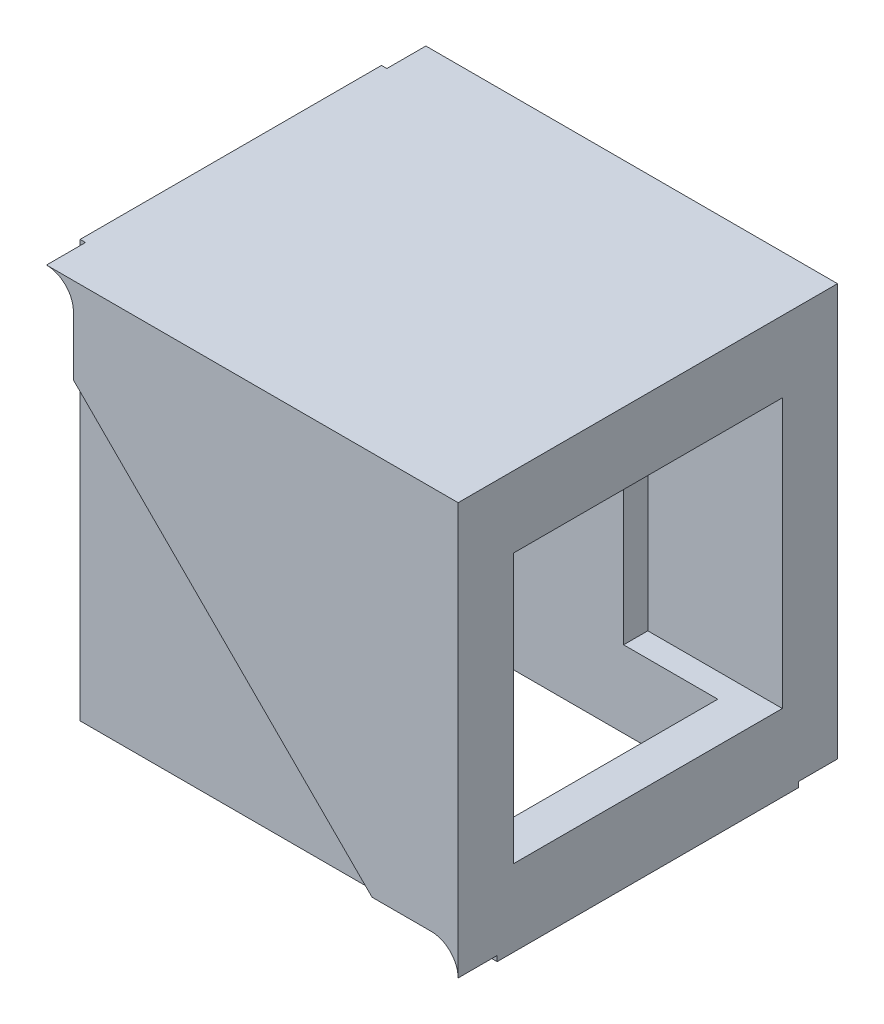
ISO-10303-21;
HEADER;
FILE_DESCRIPTION(('STEP AP214'),'2;1');
FILE_NAME('part.step','',(''),(''),'','','');
FILE_SCHEMA(('AUTOMOTIVE_DESIGN { 1 0 10303 214 1 1 1 1 }'));
ENDSEC;
DATA;
#1=APPLICATION_CONTEXT('core data for automotive mechanical design processes');
#2=APPLICATION_PROTOCOL_DEFINITION('international standard','automotive_design',2000,#1);
#3=PRODUCT_CONTEXT('',#1,'mechanical');
#4=PRODUCT('Part','Part','',(#3));
#5=PRODUCT_RELATED_PRODUCT_CATEGORY('part','',(#4));
#6=PRODUCT_DEFINITION_FORMATION('','',#4);
#7=PRODUCT_DEFINITION_CONTEXT('part definition',#1,'design');
#8=PRODUCT_DEFINITION('design','',#6,#7);
#9=PRODUCT_DEFINITION_SHAPE('','',#8);
#10=(LENGTH_UNIT() NAMED_UNIT(*) SI_UNIT(.MILLI.,.METRE.));
#11=(NAMED_UNIT(*) PLANE_ANGLE_UNIT() SI_UNIT($,.RADIAN.));
#12=(NAMED_UNIT(*) SI_UNIT($,.STERADIAN.) SOLID_ANGLE_UNIT());
#13=UNCERTAINTY_MEASURE_WITH_UNIT(LENGTH_MEASURE(1.E-05),#10,'distance_accuracy_value','');
#14=(GEOMETRIC_REPRESENTATION_CONTEXT(3) GLOBAL_UNCERTAINTY_ASSIGNED_CONTEXT((#13)) GLOBAL_UNIT_ASSIGNED_CONTEXT((#10,
#11,#12)) REPRESENTATION_CONTEXT('',''));
#15=CARTESIAN_POINT('',(0.,0.,0.));
#16=DIRECTION('',(0.,0.,1.));
#17=DIRECTION('',(1.,0.,0.));
#18=AXIS2_PLACEMENT_3D('',#15,#16,#17);
#19=CARTESIAN_POINT('',(32.0000000000212,3.99999999998279,-66.0406204336012));
#20=DIRECTION('',(1.,0.,0.));
#21=DIRECTION('',(0.,0.,-1.));
#22=AXIS2_PLACEMENT_3D('',#19,#20,#21);
#23=PLANE('',#22);
#24=DIRECTION('',(0.,1.,0.));
#25=VECTOR('',#24,1.);
#26=CARTESIAN_POINT('',(32.0000000000186,3.9999999999828,-5.80000000003517));
#27=LINE('',#26,#25);
#28=CARTESIAN_POINT('',(32.0000000000186,3.99999999998273,-5.80000000003517));
#29=VERTEX_POINT('',#28);
#30=CARTESIAN_POINT('',(32.0000000000186,9.69999999998245,-5.80000000003517));
#31=VERTEX_POINT('',#30);
#32=EDGE_CURVE('E354',#29,#31,#27,.T.);
#33=ORIENTED_EDGE('',*,*,#32,.T.);
#34=DIRECTION('',(0.,0.,-1.));
#35=VECTOR('',#34,1.);
#36=CARTESIAN_POINT('',(32.0000000000212,9.69999999998246,-66.0406204336012));
#37=LINE('',#36,#35);
#38=CARTESIAN_POINT('',(32.0000000000193,9.69999999998246,-22.2000000000358));
#39=VERTEX_POINT('',#38);
#40=EDGE_CURVE('E272',#31,#39,#37,.T.);
#41=ORIENTED_EDGE('',*,*,#40,.T.);
#42=DIRECTION('',(0.,-1.,0.));
#43=VECTOR('',#42,1.);
#44=CARTESIAN_POINT('',(32.0000000000193,3.99999999998279,-22.2000000000352));
#45=LINE('',#44,#43);
#46=CARTESIAN_POINT('',(32.0000000000203,3.99999999998273,-22.2000000000352));
#47=VERTEX_POINT('',#46);
#48=EDGE_CURVE('E348',#39,#47,#45,.T.);
#49=ORIENTED_EDGE('',*,*,#48,.T.);
#50=DIRECTION('',(0.,0.,1.));
#51=VECTOR('',#50,1.);
#52=CARTESIAN_POINT('',(32.0000000000212,3.99999999998279,-66.0406204336012));
#53=LINE('',#52,#51);
#54=EDGE_CURVE('E349',#47,#29,#53,.T.);
#55=ORIENTED_EDGE('',*,*,#54,.T.);
#56=EDGE_LOOP('',(#33,#41,#49,#55));
#57=FACE_BOUND('',#56,.T.);
#58=ADVANCED_FACE('F41',(#57),#23,.F.);
#59=CARTESIAN_POINT('',(1.10838757527151E-12,0.,-25.2000000000366));
#60=DIRECTION('',(0.,0.,1.));
#61=DIRECTION('',(1.,0.,0.));
#62=AXIS2_PLACEMENT_3D('',#59,#60,#61);
#63=PLANE('',#62);
#64=CARTESIAN_POINT('',(33.0000000000195,4.39999999998272,-25.2000000000351));
#65=DIRECTION('',(0.,0.,1.));
#66=DIRECTION('',(-1.,0.,0.));
#67=AXIS2_PLACEMENT_3D('',#64,#65,#66);
#68=CIRCLE('',#67,2.);
#69=CARTESIAN_POINT('',(35.0000000000195,4.39999999998272,-25.200000000035));
#70=VERTEX_POINT('',#69);
#71=CARTESIAN_POINT('',(33.0000000000195,6.39999999998272,-25.2000000000351));
#72=VERTEX_POINT('',#71);
#73=EDGE_CURVE('E391',#70,#72,#68,.T.);
#74=ORIENTED_EDGE('',*,*,#73,.F.);
#75=DIRECTION('',(0.,1.,0.));
#76=VECTOR('',#75,1.);
#77=CARTESIAN_POINT('',(35.0000000000195,3.9999999999828,-25.200000000035));
#78=LINE('',#77,#76);
#79=CARTESIAN_POINT('',(35.0000000000195,3.9999999999828,-25.200000000035));
#80=VERTEX_POINT('',#79);
#81=EDGE_CURVE('E416',#80,#70,#78,.T.);
#82=ORIENTED_EDGE('',*,*,#81,.F.);
#83=DIRECTION('',(1.,0.,0.));
#84=VECTOR('',#83,1.);
#85=CARTESIAN_POINT('',(4.00000000001943,3.99999999998213,-25.2000000000364));
#86=LINE('',#85,#84);
#87=CARTESIAN_POINT('',(4.00000000001943,3.99999999998213,-25.2000000000364));
#88=VERTEX_POINT('',#87);
#89=EDGE_CURVE('E420',#88,#80,#86,.T.);
#90=ORIENTED_EDGE('',*,*,#89,.F.);
#91=DIRECTION('',(0.,-1.,0.));
#92=VECTOR('',#91,1.);
#93=CARTESIAN_POINT('',(4.00000000001877,34.9999999999822,-25.2000000000364));
#94=LINE('',#93,#92);
#95=CARTESIAN_POINT('',(4.00000000001877,34.9999999999822,-25.2000000000364));
#96=VERTEX_POINT('',#95);
#97=EDGE_CURVE('E428',#96,#88,#94,.T.);
#98=ORIENTED_EDGE('',*,*,#97,.F.);
#99=DIRECTION('',(-1.,0.,0.));
#100=VECTOR('',#99,1.);
#101=CARTESIAN_POINT('',(35.0000000000195,34.9999999999822,-25.200000000035));
#102=LINE('',#101,#100);
#103=CARTESIAN_POINT('',(4.40000000001884,34.9999999999821,-25.2000000000364));
#104=VERTEX_POINT('',#103);
#105=EDGE_CURVE('E426',#104,#96,#102,.T.);
#106=ORIENTED_EDGE('',*,*,#105,.F.);
#107=CARTESIAN_POINT('',(4.40000000001888,32.9999999999821,-25.2000000000364));
#108=DIRECTION('',(0.,0.,1.));
#109=DIRECTION('',(-1.,0.,0.));
#110=AXIS2_PLACEMENT_3D('',#107,#108,#109);
#111=CIRCLE('',#110,2.);
#112=CARTESIAN_POINT('',(6.40000000001888,32.9999999999822,-25.2000000000363));
#113=VERTEX_POINT('',#112);
#114=EDGE_CURVE('E388',#113,#104,#111,.T.);
#115=ORIENTED_EDGE('',*,*,#114,.F.);
#116=DIRECTION('',(0.,1.,0.));
#117=VECTOR('',#116,1.);
#118=CARTESIAN_POINT('',(6.40000000001897,28.5999999999822,-25.2000000000363));
#119=LINE('',#118,#117);
#120=CARTESIAN_POINT('',(6.40000000001897,28.5999999999822,-25.2000000000363));
#121=VERTEX_POINT('',#120);
#122=EDGE_CURVE('E353',#121,#113,#119,.T.);
#123=ORIENTED_EDGE('',*,*,#122,.F.);
#124=DIRECTION('',(-0.707106781186563,0.707106781186532,0.));
#125=VECTOR('',#124,1.);
#126=CARTESIAN_POINT('',(6.40000000001897,28.5999999999822,-25.2000000000363));
#127=LINE('',#126,#125);
#128=CARTESIAN_POINT('',(28.6000000000195,6.39999999998262,-25.2000000000353));
#129=VERTEX_POINT('',#128);
#130=EDGE_CURVE('E372',#129,#121,#127,.T.);
#131=ORIENTED_EDGE('',*,*,#130,.F.);
#132=DIRECTION('',(-1.,0.,0.));
#133=VECTOR('',#132,1.);
#134=CARTESIAN_POINT('',(28.6000000000195,6.39999999998262,-25.2000000000353));
#135=LINE('',#134,#133);
#136=EDGE_CURVE('E394',#72,#129,#135,.T.);
#137=ORIENTED_EDGE('',*,*,#136,.F.);
#138=EDGE_LOOP('',(#74,#82,#90,#98,#106,#115,#123,#131,#137));
#139=FACE_BOUND('',#138,.T.);
#140=ADVANCED_FACE('F485',(#139),#63,.F.);
#141=CARTESIAN_POINT('',(35.0000000000193,3.9999999999828,-22.200000000035));
#142=DIRECTION('',(-1.,0.,0.));
#143=DIRECTION('',(0.,0.,1.));
#144=AXIS2_PLACEMENT_3D('',#141,#142,#143);
#145=PLANE('',#144);
#146=DIRECTION('',(0.,0.,1.));
#147=VECTOR('',#146,1.);
#148=CARTESIAN_POINT('',(35.0000000000194,29.6999999999825,-24.0000000000358));
#149=LINE('',#148,#147);
#150=CARTESIAN_POINT('',(35.0000000000194,29.6999999999825,-24.0000000000362));
#151=VERTEX_POINT('',#150);
#152=CARTESIAN_POINT('',(35.0000000000185,29.6999999999825,-4.00000000003581));
#153=VERTEX_POINT('',#152);
#154=EDGE_CURVE('E257',#151,#153,#149,.T.);
#155=ORIENTED_EDGE('',*,*,#154,.F.);
#156=DIRECTION('',(0.,1.,0.));
#157=VECTOR('',#156,1.);
#158=CARTESIAN_POINT('',(35.0000000000194,29.6999999999825,-24.0000000000358));
#159=LINE('',#158,#157);
#160=CARTESIAN_POINT('',(35.0000000000194,9.69999999998246,-24.0000000000358));
#161=VERTEX_POINT('',#160);
#162=EDGE_CURVE('E56',#161,#151,#159,.T.);
#163=ORIENTED_EDGE('',*,*,#162,.F.);
#164=DIRECTION('',(0.,0.,-1.));
#165=VECTOR('',#164,1.);
#166=CARTESIAN_POINT('',(35.0000000000194,9.69999999998246,-24.0000000000358));
#167=LINE('',#166,#165);
#168=CARTESIAN_POINT('',(35.0000000000185,9.69999999998245,-4.00000000003581));
#169=VERTEX_POINT('',#168);
#170=EDGE_CURVE('E248',#169,#161,#167,.T.);
#171=ORIENTED_EDGE('',*,*,#170,.F.);
#172=DIRECTION('',(0.,-1.,0.));
#173=VECTOR('',#172,1.);
#174=CARTESIAN_POINT('',(35.0000000000185,29.6999999999825,-4.00000000003581));
#175=LINE('',#174,#173);
#176=EDGE_CURVE('E251',#153,#169,#175,.T.);
#177=ORIENTED_EDGE('',*,*,#176,.F.);
#178=EDGE_LOOP('',(#155,#163,#171,#177));
#179=FACE_BOUND('',#178,.T.);
#180=ORIENTED_EDGE('',*,*,#81,.T.);
#181=DIRECTION('',(0.,0.,1.));
#182=VECTOR('',#181,1.);
#183=CARTESIAN_POINT('',(35.0000000000196,4.39999999998276,-28.100000000035));
#184=LINE('',#183,#182);
#185=CARTESIAN_POINT('',(35.0000000000196,4.39999999998276,-28.100000000035));
#186=VERTEX_POINT('',#185);
#187=EDGE_CURVE('E407',#186,#70,#184,.T.);
#188=ORIENTED_EDGE('',*,*,#187,.F.);
#189=DIRECTION('',(0.,-1.,0.));
#190=VECTOR('',#189,1.);
#191=CARTESIAN_POINT('',(35.0000000000196,4.39999999998276,-28.100000000035));
#192=LINE('',#191,#190);
#193=CARTESIAN_POINT('',(35.0000000000196,34.9999999999822,-28.100000000035));
#194=VERTEX_POINT('',#193);
#195=EDGE_CURVE('E377',#194,#186,#192,.T.);
#196=ORIENTED_EDGE('',*,*,#195,.F.);
#197=DIRECTION('',(0.,0.,-1.));
#198=VECTOR('',#197,1.);
#199=CARTESIAN_POINT('',(35.0000000000193,34.9999999999822,-22.200000000035));
#200=LINE('',#199,#198);
#201=CARTESIAN_POINT('',(35.0000000000196,34.9999999999822,0.0999999999634219));
#202=VERTEX_POINT('',#201);
#203=EDGE_CURVE('E439',#202,#194,#200,.T.);
#204=ORIENTED_EDGE('',*,*,#203,.F.);
#205=DIRECTION('',(0.,1.,0.));
#206=VECTOR('',#205,1.);
#207=CARTESIAN_POINT('',(35.0000000000196,4.39999999998276,0.0999999999634219));
#208=LINE('',#207,#206);
#209=CARTESIAN_POINT('',(35.0000000000196,4.39999999998276,0.0999999999634219));
#210=VERTEX_POINT('',#209);
#211=EDGE_CURVE('E286',#210,#202,#208,.T.);
#212=ORIENTED_EDGE('',*,*,#211,.F.);
#213=DIRECTION('',(0.,0.,-1.));
#214=VECTOR('',#213,1.);
#215=CARTESIAN_POINT('',(35.0000000000196,4.39999999998276,0.0999999999634219));
#216=LINE('',#215,#214);
#217=CARTESIAN_POINT('',(35.0000000000185,4.39999999998272,-2.80000000003658));
#218=VERTEX_POINT('',#217);
#219=EDGE_CURVE('E317',#210,#218,#216,.T.);
#220=ORIENTED_EDGE('',*,*,#219,.T.);
#221=DIRECTION('',(0.,1.,0.));
#222=VECTOR('',#221,1.);
#223=CARTESIAN_POINT('',(35.0000000000185,3.9999999999828,-2.80000000003504));
#224=LINE('',#223,#222);
#225=CARTESIAN_POINT('',(35.0000000000185,3.9999999999828,-2.80000000003504));
#226=VERTEX_POINT('',#225);
#227=EDGE_CURVE('E336',#226,#218,#224,.T.);
#228=ORIENTED_EDGE('',*,*,#227,.F.);
#229=DIRECTION('',(0.,0.,-1.));
#230=VECTOR('',#229,1.);
#231=CARTESIAN_POINT('',(35.0000000000193,3.9999999999828,-22.200000000035));
#232=LINE('',#231,#230);
#233=EDGE_CURVE('E423',#226,#80,#232,.T.);
#234=ORIENTED_EDGE('',*,*,#233,.T.);
#235=EDGE_LOOP('',(#180,#188,#196,#204,#212,#220,#228,#234));
#236=FACE_BOUND('',#235,.T.);
#237=ADVANCED_FACE('F43',(#179,#236),#145,.F.);
#238=CARTESIAN_POINT('',(35.0000000000193,34.9999999999822,-22.200000000035));
#239=DIRECTION('',(0.,-1.,0.));
#240=DIRECTION('',(0.,0.,-1.));
#241=AXIS2_PLACEMENT_3D('',#238,#239,#240);
#242=PLANE('',#241);
#243=ORIENTED_EDGE('',*,*,#203,.T.);
#244=DIRECTION('',(1.,0.,0.));
#245=VECTOR('',#244,1.);
#246=CARTESIAN_POINT('',(35.0000000000196,34.9999999999822,-28.100000000035));
#247=LINE('',#246,#245);
#248=CARTESIAN_POINT('',(4.40000000001896,34.9999999999821,-28.1000000000364));
#249=VERTEX_POINT('',#248);
#250=EDGE_CURVE('E374',#249,#194,#247,.T.);
#251=ORIENTED_EDGE('',*,*,#250,.F.);
#252=DIRECTION('',(0.,0.,1.));
#253=VECTOR('',#252,1.);
#254=CARTESIAN_POINT('',(4.40000000001896,34.9999999999821,-28.1000000000364));
#255=LINE('',#254,#253);
#256=EDGE_CURVE('E410',#249,#104,#255,.T.);
#257=ORIENTED_EDGE('',*,*,#256,.T.);
#258=ORIENTED_EDGE('',*,*,#105,.T.);
#259=DIRECTION('',(0.,0.,-1.));
#260=VECTOR('',#259,1.);
#261=CARTESIAN_POINT('',(4.00000000001863,34.9999999999822,-22.2000000000364));
#262=LINE('',#261,#260);
#263=CARTESIAN_POINT('',(4.00000000001777,34.9999999999822,-2.80000000003641));
#264=VERTEX_POINT('',#263);
#265=EDGE_CURVE('E436',#264,#96,#262,.T.);
#266=ORIENTED_EDGE('',*,*,#265,.F.);
#267=DIRECTION('',(-1.,0.,0.));
#268=VECTOR('',#267,1.);
#269=CARTESIAN_POINT('',(4.00000000001777,34.9999999999822,-2.80000000003641));
#270=LINE('',#269,#268);
#271=CARTESIAN_POINT('',(4.400000000019,34.9999999999822,-2.80000000003658));
#272=VERTEX_POINT('',#271);
#273=EDGE_CURVE('E338',#272,#264,#270,.T.);
#274=ORIENTED_EDGE('',*,*,#273,.F.);
#275=DIRECTION('',(0.,0.,-1.));
#276=VECTOR('',#275,1.);
#277=CARTESIAN_POINT('',(4.40000000001896,34.9999999999821,0.0999999999634219));
#278=LINE('',#277,#276);
#279=CARTESIAN_POINT('',(4.40000000001896,34.9999999999821,0.0999999999634219));
#280=VERTEX_POINT('',#279);
#281=EDGE_CURVE('E314',#280,#272,#278,.T.);
#282=ORIENTED_EDGE('',*,*,#281,.F.);
#283=DIRECTION('',(-1.,0.,0.));
#284=VECTOR('',#283,1.);
#285=CARTESIAN_POINT('',(35.0000000000196,34.9999999999822,0.0999999999634219));
#286=LINE('',#285,#284);
#287=EDGE_CURVE('E289',#202,#280,#286,.T.);
#288=ORIENTED_EDGE('',*,*,#287,.F.);
#289=EDGE_LOOP('',(#243,#251,#257,#258,#266,#274,#282,#288));
#290=FACE_BOUND('',#289,.T.);
#291=ADVANCED_FACE('F484',(#290),#242,.F.);
#292=CARTESIAN_POINT('',(4.00000000001863,34.9999999999822,-22.2000000000364));
#293=DIRECTION('',(1.,0.,0.));
#294=DIRECTION('',(0.,0.,-1.));
#295=AXIS2_PLACEMENT_3D('',#292,#293,#294);
#296=PLANE('',#295);
#297=ORIENTED_EDGE('',*,*,#97,.T.);
#298=DIRECTION('',(0.,0.,-1.));
#299=VECTOR('',#298,1.);
#300=CARTESIAN_POINT('',(4.0000000000193,3.99999999998213,-22.2000000000364));
#301=LINE('',#300,#299);
#302=CARTESIAN_POINT('',(4.0000000000193,3.99999999998213,-22.2000000000364));
#303=VERTEX_POINT('',#302);
#304=EDGE_CURVE('E433',#303,#88,#301,.T.);
#305=ORIENTED_EDGE('',*,*,#304,.F.);
#306=DIRECTION('',(0.,-1.,0.));
#307=VECTOR('',#306,1.);
#308=CARTESIAN_POINT('',(4.00000000001863,34.9999999999822,-22.2000000000364));
#309=LINE('',#308,#307);
#310=CARTESIAN_POINT('',(4.0000000000187,31.9999999999821,-22.2000000000364));
#311=VERTEX_POINT('',#310);
#312=EDGE_CURVE('E417',#311,#303,#309,.T.);
#313=ORIENTED_EDGE('',*,*,#312,.F.);
#314=DIRECTION('',(0.,0.,1.));
#315=VECTOR('',#314,1.);
#316=CARTESIAN_POINT('',(4.00000000002121,31.9999999999821,-66.0406204336024));
#317=LINE('',#316,#315);
#318=CARTESIAN_POINT('',(4.00000000001796,31.9999999999821,-5.80000000003641));
#319=VERTEX_POINT('',#318);
#320=EDGE_CURVE('E360',#311,#319,#317,.T.);
#321=ORIENTED_EDGE('',*,*,#320,.T.);
#322=DIRECTION('',(0.,-1.,0.));
#323=VECTOR('',#322,1.);
#324=CARTESIAN_POINT('',(4.00000000001856,3.99999999998213,-5.8000000000364));
#325=LINE('',#324,#323);
#326=CARTESIAN_POINT('',(4.00000000001856,3.99999999998213,-5.8000000000364));
#327=VERTEX_POINT('',#326);
#328=EDGE_CURVE('E330',#319,#327,#325,.T.);
#329=ORIENTED_EDGE('',*,*,#328,.T.);
#330=DIRECTION('',(0.,0.,1.));
#331=VECTOR('',#330,1.);
#332=CARTESIAN_POINT('',(4.00000000001856,3.99999999998213,-5.8000000000364));
#333=LINE('',#332,#331);
#334=CARTESIAN_POINT('',(4.00000000001843,3.99999999998213,-2.8000000000364));
#335=VERTEX_POINT('',#334);
#336=EDGE_CURVE('E333',#327,#335,#333,.T.);
#337=ORIENTED_EDGE('',*,*,#336,.T.);
#338=DIRECTION('',(0.,-1.,0.));
#339=VECTOR('',#338,1.);
#340=CARTESIAN_POINT('',(4.00000000001843,3.99999999998213,-2.8000000000364));
#341=LINE('',#340,#339);
#342=EDGE_CURVE('E331',#264,#335,#341,.T.);
#343=ORIENTED_EDGE('',*,*,#342,.F.);
#344=ORIENTED_EDGE('',*,*,#265,.T.);
#345=EDGE_LOOP('',(#297,#305,#313,#321,#329,#337,#343,#344));
#346=FACE_BOUND('',#345,.T.);
#347=ADVANCED_FACE('F464',(#346),#296,.F.);
#348=CARTESIAN_POINT('',(4.0000000000193,3.99999999998213,-22.2000000000364));
#349=DIRECTION('',(0.,1.,0.));
#350=DIRECTION('',(-1.,0.,0.));
#351=AXIS2_PLACEMENT_3D('',#348,#349,#350);
#352=PLANE('',#351);
#353=ORIENTED_EDGE('',*,*,#89,.T.);
#354=ORIENTED_EDGE('',*,*,#233,.F.);
#355=DIRECTION('',(1.,0.,0.));
#356=VECTOR('',#355,1.);
#357=CARTESIAN_POINT('',(35.0000000000185,3.9999999999828,-2.80000000003504));
#358=LINE('',#357,#356);
#359=EDGE_CURVE('E326',#335,#226,#358,.T.);
#360=ORIENTED_EDGE('',*,*,#359,.F.);
#361=ORIENTED_EDGE('',*,*,#336,.F.);
#362=DIRECTION('',(1.,0.,0.));
#363=VECTOR('',#362,1.);
#364=CARTESIAN_POINT('',(35.0000000000186,3.9999999999828,-5.80000000003504));
#365=LINE('',#364,#363);
#366=EDGE_CURVE('E327',#327,#29,#365,.T.);
#367=ORIENTED_EDGE('',*,*,#366,.T.);
#368=ORIENTED_EDGE('',*,*,#54,.F.);
#369=DIRECTION('',(1.,0.,0.));
#370=VECTOR('',#369,1.);
#371=CARTESIAN_POINT('',(4.0000000000193,3.99999999998213,-22.2000000000364));
#372=LINE('',#371,#370);
#373=EDGE_CURVE('E419',#303,#47,#372,.T.);
#374=ORIENTED_EDGE('',*,*,#373,.F.);
#375=ORIENTED_EDGE('',*,*,#304,.T.);
#376=EDGE_LOOP('',(#353,#354,#360,#361,#367,#368,#374,#375));
#377=FACE_BOUND('',#376,.T.);
#378=ADVANCED_FACE('F470',(#377),#352,.F.);
#379=CARTESIAN_POINT('',(9.76655111237216E-13,0.,-22.2000000000366));
#380=DIRECTION('',(0.,0.,1.));
#381=DIRECTION('',(1.,0.,0.));
#382=AXIS2_PLACEMENT_3D('',#379,#380,#381);
#383=PLANE('',#382);
#384=DIRECTION('',(1.,0.,0.));
#385=VECTOR('',#384,1.);
#386=CARTESIAN_POINT('',(9.76655111237216E-13,9.69999999998246,-22.2000000000366));
#387=LINE('',#386,#385);
#388=CARTESIAN_POINT('',(25.0000000000193,9.69999999998246,-22.2000000000355));
#389=VERTEX_POINT('',#388);
#390=EDGE_CURVE('E275',#389,#39,#387,.T.);
#391=ORIENTED_EDGE('',*,*,#390,.F.);
#392=DIRECTION('',(0.,-1.,0.));
#393=VECTOR('',#392,1.);
#394=CARTESIAN_POINT('',(25.0000000000193,0.,-22.2000000000355));
#395=LINE('',#394,#393);
#396=CARTESIAN_POINT('',(25.0000000000193,29.6999999999825,-22.2000000000355));
#397=VERTEX_POINT('',#396);
#398=EDGE_CURVE('E263',#397,#389,#395,.T.);
#399=ORIENTED_EDGE('',*,*,#398,.F.);
#400=DIRECTION('',(-1.,0.,0.));
#401=VECTOR('',#400,1.);
#402=CARTESIAN_POINT('',(9.76655111237216E-13,29.6999999999825,-22.2000000000366));
#403=LINE('',#402,#401);
#404=CARTESIAN_POINT('',(32.0000000000193,29.6999999999825,-22.2000000000358));
#405=VERTEX_POINT('',#404);
#406=EDGE_CURVE('E238',#405,#397,#403,.T.);
#407=ORIENTED_EDGE('',*,*,#406,.F.);
#408=CARTESIAN_POINT('',(32.0000000000212,31.9999999999821,-22.2000000000352));
#409=VERTEX_POINT('',#408);
#410=EDGE_CURVE('E350',#409,#405,#45,.T.);
#411=ORIENTED_EDGE('',*,*,#410,.F.);
#412=DIRECTION('',(1.,0.,0.));
#413=VECTOR('',#412,1.);
#414=CARTESIAN_POINT('',(4.00000000001928,31.9999999999821,-22.2000000000364));
#415=LINE('',#414,#413);
#416=EDGE_CURVE('E345',#311,#409,#415,.T.);
#417=ORIENTED_EDGE('',*,*,#416,.F.);
#418=ORIENTED_EDGE('',*,*,#312,.T.);
#419=ORIENTED_EDGE('',*,*,#373,.T.);
#420=ORIENTED_EDGE('',*,*,#48,.F.);
#421=EDGE_LOOP('',(#391,#399,#407,#411,#417,#418,#419,#420));
#422=FACE_BOUND('',#421,.T.);
#423=ADVANCED_FACE('F461',(#422),#383,.T.);
#424=CARTESIAN_POINT('',(6.4000000000191,28.5999999999822,-28.1000000000363));
#425=DIRECTION('',(1.,0.,0.));
#426=DIRECTION('',(0.,0.,-1.));
#427=AXIS2_PLACEMENT_3D('',#424,#425,#426);
#428=PLANE('',#427);
#429=ORIENTED_EDGE('',*,*,#122,.T.);
#430=DIRECTION('',(0.,0.,1.));
#431=VECTOR('',#430,1.);
#432=CARTESIAN_POINT('',(6.40000000001901,32.9999999999822,-28.1000000000363));
#433=LINE('',#432,#431);
#434=CARTESIAN_POINT('',(6.40000000001901,32.9999999999822,-28.1000000000363));
#435=VERTEX_POINT('',#434);
#436=EDGE_CURVE('E413',#435,#113,#433,.T.);
#437=ORIENTED_EDGE('',*,*,#436,.F.);
#438=DIRECTION('',(0.,1.,0.));
#439=VECTOR('',#438,1.);
#440=CARTESIAN_POINT('',(6.4000000000191,28.5999999999822,-28.1000000000363));
#441=LINE('',#440,#439);
#442=CARTESIAN_POINT('',(6.4000000000191,28.5999999999822,-28.1000000000363));
#443=VERTEX_POINT('',#442);
#444=EDGE_CURVE('E368',#443,#435,#441,.T.);
#445=ORIENTED_EDGE('',*,*,#444,.F.);
#446=DIRECTION('',(0.,0.,1.));
#447=VECTOR('',#446,1.);
#448=CARTESIAN_POINT('',(6.4000000000191,28.5999999999822,-28.1000000000363));
#449=LINE('',#448,#447);
#450=EDGE_CURVE('E385',#443,#121,#449,.T.);
#451=ORIENTED_EDGE('',*,*,#450,.T.);
#452=EDGE_LOOP('',(#429,#437,#445,#451));
#453=FACE_BOUND('',#452,.T.);
#454=ADVANCED_FACE('F537',(#453),#428,.F.);
#455=CARTESIAN_POINT('',(4.400000000019,32.9999999999821,-28.1000000000364));
#456=DIRECTION('',(0.,0.,1.));
#457=DIRECTION('',(1.,0.,0.));
#458=AXIS2_PLACEMENT_3D('',#455,#456,#457);
#459=CYLINDRICAL_SURFACE('',#458,2.);
#460=ORIENTED_EDGE('',*,*,#114,.T.);
#461=ORIENTED_EDGE('',*,*,#256,.F.);
#462=CARTESIAN_POINT('',(4.400000000019,32.9999999999821,-28.1000000000364));
#463=DIRECTION('',(0.,0.,1.));
#464=DIRECTION('',(-1.,0.,0.));
#465=AXIS2_PLACEMENT_3D('',#462,#463,#464);
#466=CIRCLE('',#465,2.);
#467=EDGE_CURVE('E371',#435,#249,#466,.T.);
#468=ORIENTED_EDGE('',*,*,#467,.F.);
#469=ORIENTED_EDGE('',*,*,#436,.T.);
#470=EDGE_LOOP('',(#460,#461,#468,#469));
#471=FACE_BOUND('',#470,.T.);
#472=ADVANCED_FACE('F533',(#471),#459,.F.);
#473=CARTESIAN_POINT('',(33.0000000000196,4.39999999998272,-28.1000000000351));
#474=DIRECTION('',(0.,0.,1.));
#475=DIRECTION('',(1.,0.,0.));
#476=AXIS2_PLACEMENT_3D('',#473,#474,#475);
#477=CYLINDRICAL_SURFACE('',#476,2.);
#478=ORIENTED_EDGE('',*,*,#73,.T.);
#479=DIRECTION('',(0.,0.,1.));
#480=VECTOR('',#479,1.);
#481=CARTESIAN_POINT('',(33.0000000000196,6.39999999998272,-28.1000000000351));
#482=LINE('',#481,#480);
#483=CARTESIAN_POINT('',(33.0000000000196,6.39999999998272,-28.1000000000351));
#484=VERTEX_POINT('',#483);
#485=EDGE_CURVE('E404',#484,#72,#482,.T.);
#486=ORIENTED_EDGE('',*,*,#485,.F.);
#487=CARTESIAN_POINT('',(33.0000000000196,4.39999999998272,-28.1000000000351));
#488=DIRECTION('',(0.,0.,1.));
#489=DIRECTION('',(-1.,0.,0.));
#490=AXIS2_PLACEMENT_3D('',#487,#488,#489);
#491=CIRCLE('',#490,2.);
#492=EDGE_CURVE('E379',#186,#484,#491,.T.);
#493=ORIENTED_EDGE('',*,*,#492,.F.);
#494=ORIENTED_EDGE('',*,*,#187,.T.);
#495=EDGE_LOOP('',(#478,#486,#493,#494));
#496=FACE_BOUND('',#495,.T.);
#497=ADVANCED_FACE('F493',(#496),#477,.F.);
#498=CARTESIAN_POINT('',(28.6000000000196,6.39999999998262,-28.1000000000353));
#499=DIRECTION('',(0.,1.,0.));
#500=DIRECTION('',(-1.,0.,0.));
#501=AXIS2_PLACEMENT_3D('',#498,#499,#500);
#502=PLANE('',#501);
#503=ORIENTED_EDGE('',*,*,#136,.T.);
#504=DIRECTION('',(0.,0.,1.));
#505=VECTOR('',#504,1.);
#506=CARTESIAN_POINT('',(28.6000000000196,6.39999999998262,-28.1000000000353));
#507=LINE('',#506,#505);
#508=CARTESIAN_POINT('',(28.6000000000196,6.39999999998262,-28.1000000000353));
#509=VERTEX_POINT('',#508);
#510=EDGE_CURVE('E401',#509,#129,#507,.T.);
#511=ORIENTED_EDGE('',*,*,#510,.F.);
#512=DIRECTION('',(-1.,0.,0.));
#513=VECTOR('',#512,1.);
#514=CARTESIAN_POINT('',(28.6000000000196,6.39999999998262,-28.1000000000353));
#515=LINE('',#514,#513);
#516=EDGE_CURVE('E381',#484,#509,#515,.T.);
#517=ORIENTED_EDGE('',*,*,#516,.F.);
#518=ORIENTED_EDGE('',*,*,#485,.T.);
#519=EDGE_LOOP('',(#503,#511,#517,#518));
#520=FACE_BOUND('',#519,.T.);
#521=ADVANCED_FACE('F543',(#520),#502,.F.);
#522=CARTESIAN_POINT('',(6.4000000000191,28.5999999999822,-28.1000000000363));
#523=DIRECTION('',(0.707106781186532,0.707106781186563,0.));
#524=DIRECTION('',(-0.707106781186563,0.707106781186532,0.));
#525=AXIS2_PLACEMENT_3D('',#522,#523,#524);
#526=PLANE('',#525);
#527=ORIENTED_EDGE('',*,*,#130,.T.);
#528=ORIENTED_EDGE('',*,*,#450,.F.);
#529=DIRECTION('',(-0.707106781186563,0.707106781186532,0.));
#530=VECTOR('',#529,1.);
#531=CARTESIAN_POINT('',(6.4000000000191,28.5999999999822,-28.1000000000363));
#532=LINE('',#531,#530);
#533=EDGE_CURVE('E383',#509,#443,#532,.T.);
#534=ORIENTED_EDGE('',*,*,#533,.F.);
#535=ORIENTED_EDGE('',*,*,#510,.T.);
#536=EDGE_LOOP('',(#527,#528,#534,#535));
#537=FACE_BOUND('',#536,.T.);
#538=ADVANCED_FACE('F540',(#537),#526,.F.);
#539=CARTESIAN_POINT('',(4.400000000019,32.9999999999821,-28.1000000000364));
#540=DIRECTION('',(0.,0.,-1.));
#541=DIRECTION('',(-1.,0.,0.));
#542=AXIS2_PLACEMENT_3D('',#539,#540,#541);
#543=PLANE('',#542);
#544=ORIENTED_EDGE('',*,*,#444,.T.);
#545=ORIENTED_EDGE('',*,*,#467,.T.);
#546=ORIENTED_EDGE('',*,*,#250,.T.);
#547=ORIENTED_EDGE('',*,*,#195,.T.);
#548=ORIENTED_EDGE('',*,*,#492,.T.);
#549=ORIENTED_EDGE('',*,*,#516,.T.);
#550=ORIENTED_EDGE('',*,*,#533,.T.);
#551=EDGE_LOOP('',(#544,#545,#546,#547,#548,#549,#550));
#552=FACE_BOUND('',#551,.T.);
#553=ADVANCED_FACE('F497',(#552),#543,.T.);
#554=CARTESIAN_POINT('',(4.00000000002121,31.9999999999821,-66.0406204336024));
#555=DIRECTION('',(0.,1.,0.));
#556=DIRECTION('',(-1.,0.,0.));
#557=AXIS2_PLACEMENT_3D('',#554,#555,#556);
#558=PLANE('',#557);
#559=ORIENTED_EDGE('',*,*,#320,.F.);
#560=ORIENTED_EDGE('',*,*,#416,.T.);
#561=DIRECTION('',(0.,0.,1.));
#562=VECTOR('',#561,1.);
#563=CARTESIAN_POINT('',(32.0000000000212,31.9999999999821,-66.0406204336012));
#564=LINE('',#563,#562);
#565=CARTESIAN_POINT('',(32.0000000000186,31.9999999999821,-5.80000000003518));
#566=VERTEX_POINT('',#565);
#567=EDGE_CURVE('E363',#409,#566,#564,.T.);
#568=ORIENTED_EDGE('',*,*,#567,.T.);
#569=DIRECTION('',(-1.,0.,0.));
#570=VECTOR('',#569,1.);
#571=CARTESIAN_POINT('',(4.00000000001856,31.9999999999821,-5.80000000003641));
#572=LINE('',#571,#570);
#573=EDGE_CURVE('E357',#566,#319,#572,.T.);
#574=ORIENTED_EDGE('',*,*,#573,.T.);
#575=EDGE_LOOP('',(#559,#560,#568,#574));
#576=FACE_BOUND('',#575,.T.);
#577=ADVANCED_FACE('F457',(#576),#558,.F.);
#578=ORIENTED_EDGE('',*,*,#410,.T.);
#579=DIRECTION('',(0.,0.,1.));
#580=VECTOR('',#579,1.);
#581=CARTESIAN_POINT('',(32.0000000000212,29.6999999999825,-66.0406204336012));
#582=LINE('',#581,#580);
#583=CARTESIAN_POINT('',(32.0000000000186,29.6999999999825,-5.80000000003518));
#584=VERTEX_POINT('',#583);
#585=EDGE_CURVE('E268',#405,#584,#582,.T.);
#586=ORIENTED_EDGE('',*,*,#585,.T.);
#587=EDGE_CURVE('E344',#584,#566,#27,.T.);
#588=ORIENTED_EDGE('',*,*,#587,.T.);
#589=ORIENTED_EDGE('',*,*,#567,.F.);
#590=EDGE_LOOP('',(#578,#586,#588,#589));
#591=FACE_BOUND('',#590,.T.);
#592=ADVANCED_FACE('F449',(#591),#23,.F.);
#593=CARTESIAN_POINT('',(2.54690783189576E-13,0.,-5.80000000003658));
#594=DIRECTION('',(0.,0.,-1.));
#595=DIRECTION('',(-1.,0.,0.));
#596=AXIS2_PLACEMENT_3D('',#593,#594,#595);
#597=PLANE('',#596);
#598=DIRECTION('',(-1.,0.,0.));
#599=VECTOR('',#598,1.);
#600=CARTESIAN_POINT('',(2.54690783189576E-13,9.69999999998245,-5.80000000003658));
#601=LINE('',#600,#599);
#602=CARTESIAN_POINT('',(25.0000000000186,9.69999999998245,-5.80000000003548));
#603=VERTEX_POINT('',#602);
#604=EDGE_CURVE('E11',#31,#603,#601,.T.);
#605=ORIENTED_EDGE('',*,*,#604,.F.);
#606=ORIENTED_EDGE('',*,*,#32,.F.);
#607=ORIENTED_EDGE('',*,*,#366,.F.);
#608=ORIENTED_EDGE('',*,*,#328,.F.);
#609=ORIENTED_EDGE('',*,*,#573,.F.);
#610=ORIENTED_EDGE('',*,*,#587,.F.);
#611=DIRECTION('',(1.,0.,0.));
#612=VECTOR('',#611,1.);
#613=CARTESIAN_POINT('',(2.54690783189576E-13,29.6999999999825,-5.80000000003658));
#614=LINE('',#613,#612);
#615=CARTESIAN_POINT('',(25.0000000000186,29.6999999999825,-5.80000000003548));
#616=VERTEX_POINT('',#615);
#617=EDGE_CURVE('E49',#616,#584,#614,.T.);
#618=ORIENTED_EDGE('',*,*,#617,.F.);
#619=DIRECTION('',(0.,1.,0.));
#620=VECTOR('',#619,1.);
#621=CARTESIAN_POINT('',(25.0000000000186,0.,-5.80000000003548));
#622=LINE('',#621,#620);
#623=EDGE_CURVE('E441',#603,#616,#622,.T.);
#624=ORIENTED_EDGE('',*,*,#623,.F.);
#625=EDGE_LOOP('',(#605,#606,#607,#608,#609,#610,#618,#624));
#626=FACE_BOUND('',#625,.T.);
#627=ADVANCED_FACE('F453',(#626),#597,.T.);
#628=CARTESIAN_POINT('',(1.22958319155278E-13,0.,-2.80000000003658));
#629=DIRECTION('',(0.,0.,-1.));
#630=DIRECTION('',(-1.,0.,0.));
#631=AXIS2_PLACEMENT_3D('',#628,#629,#630);
#632=PLANE('',#631);
#633=CARTESIAN_POINT('',(4.400000000019,32.9999999999821,-2.80000000003658));
#634=DIRECTION('',(0.,0.,-1.));
#635=DIRECTION('',(1.,0.,0.));
#636=AXIS2_PLACEMENT_3D('',#633,#634,#635);
#637=CIRCLE('',#636,2.);
#638=CARTESIAN_POINT('',(6.40000000001901,32.9999999999822,-2.80000000003658));
#639=VERTEX_POINT('',#638);
#640=EDGE_CURVE('E304',#272,#639,#637,.T.);
#641=ORIENTED_EDGE('',*,*,#640,.F.);
#642=ORIENTED_EDGE('',*,*,#273,.T.);
#643=ORIENTED_EDGE('',*,*,#342,.T.);
#644=ORIENTED_EDGE('',*,*,#359,.T.);
#645=ORIENTED_EDGE('',*,*,#227,.T.);
#646=CARTESIAN_POINT('',(33.0000000000196,4.39999999998272,-2.80000000003658));
#647=DIRECTION('',(0.,0.,-1.));
#648=DIRECTION('',(1.,0.,0.));
#649=AXIS2_PLACEMENT_3D('',#646,#647,#648);
#650=CIRCLE('',#649,2.);
#651=CARTESIAN_POINT('',(33.0000000000196,6.39999999998272,-2.80000000003658));
#652=VERTEX_POINT('',#651);
#653=EDGE_CURVE('E301',#652,#218,#650,.T.);
#654=ORIENTED_EDGE('',*,*,#653,.F.);
#655=DIRECTION('',(1.,0.,0.));
#656=VECTOR('',#655,1.);
#657=CARTESIAN_POINT('',(28.6000000000196,6.39999999998262,-2.80000000003658));
#658=LINE('',#657,#656);
#659=CARTESIAN_POINT('',(28.6000000000196,6.39999999998262,-2.80000000003658));
#660=VERTEX_POINT('',#659);
#661=EDGE_CURVE('E298',#660,#652,#658,.T.);
#662=ORIENTED_EDGE('',*,*,#661,.F.);
#663=DIRECTION('',(0.707106781186563,-0.707106781186532,0.));
#664=VECTOR('',#663,1.);
#665=CARTESIAN_POINT('',(6.4000000000191,28.5999999999822,-2.80000000003658));
#666=LINE('',#665,#664);
#667=CARTESIAN_POINT('',(6.4000000000191,28.5999999999822,-2.80000000003658));
#668=VERTEX_POINT('',#667);
#669=EDGE_CURVE('E277',#668,#660,#666,.T.);
#670=ORIENTED_EDGE('',*,*,#669,.F.);
#671=DIRECTION('',(0.,-1.,0.));
#672=VECTOR('',#671,1.);
#673=CARTESIAN_POINT('',(6.40000000001901,32.9999999999822,-2.80000000003658));
#674=LINE('',#673,#672);
#675=EDGE_CURVE('E282',#639,#668,#674,.T.);
#676=ORIENTED_EDGE('',*,*,#675,.F.);
#677=EDGE_LOOP('',(#641,#642,#643,#644,#645,#654,#662,#670,#676));
#678=FACE_BOUND('',#677,.T.);
#679=ADVANCED_FACE('F528',(#678),#632,.F.);
#680=CARTESIAN_POINT('',(6.4000000000191,28.5999999999822,0.0999999999634219));
#681=DIRECTION('',(0.707106781186532,0.707106781186563,0.));
#682=DIRECTION('',(-0.707106781186563,0.707106781186532,0.));
#683=AXIS2_PLACEMENT_3D('',#680,#681,#682);
#684=PLANE('',#683);
#685=ORIENTED_EDGE('',*,*,#669,.T.);
#686=DIRECTION('',(0.,0.,-1.));
#687=VECTOR('',#686,1.);
#688=CARTESIAN_POINT('',(28.6000000000196,6.39999999998262,0.0999999999634219));
#689=LINE('',#688,#687);
#690=CARTESIAN_POINT('',(28.6000000000196,6.39999999998262,0.0999999999634219));
#691=VERTEX_POINT('',#690);
#692=EDGE_CURVE('E323',#691,#660,#689,.T.);
#693=ORIENTED_EDGE('',*,*,#692,.F.);
#694=DIRECTION('',(0.707106781186563,-0.707106781186532,0.));
#695=VECTOR('',#694,1.);
#696=CARTESIAN_POINT('',(6.4000000000191,28.5999999999822,0.0999999999634219));
#697=LINE('',#696,#695);
#698=CARTESIAN_POINT('',(6.4000000000191,28.5999999999822,0.0999999999634219));
#699=VERTEX_POINT('',#698);
#700=EDGE_CURVE('E278',#699,#691,#697,.T.);
#701=ORIENTED_EDGE('',*,*,#700,.F.);
#702=DIRECTION('',(0.,0.,-1.));
#703=VECTOR('',#702,1.);
#704=CARTESIAN_POINT('',(6.4000000000191,28.5999999999822,0.0999999999634219));
#705=LINE('',#704,#703);
#706=EDGE_CURVE('E295',#699,#668,#705,.T.);
#707=ORIENTED_EDGE('',*,*,#706,.T.);
#708=EDGE_LOOP('',(#685,#693,#701,#707));
#709=FACE_BOUND('',#708,.T.);
#710=ADVANCED_FACE('F520',(#709),#684,.F.);
#711=CARTESIAN_POINT('',(28.6000000000196,6.39999999998262,0.0999999999634219));
#712=DIRECTION('',(0.,1.,0.));
#713=DIRECTION('',(-1.,0.,0.));
#714=AXIS2_PLACEMENT_3D('',#711,#712,#713);
#715=PLANE('',#714);
#716=ORIENTED_EDGE('',*,*,#661,.T.);
#717=DIRECTION('',(0.,0.,-1.));
#718=VECTOR('',#717,1.);
#719=CARTESIAN_POINT('',(33.0000000000196,6.39999999998272,0.0999999999634219));
#720=LINE('',#719,#718);
#721=CARTESIAN_POINT('',(33.0000000000196,6.39999999998272,0.0999999999634219));
#722=VERTEX_POINT('',#721);
#723=EDGE_CURVE('E320',#722,#652,#720,.T.);
#724=ORIENTED_EDGE('',*,*,#723,.F.);
#725=DIRECTION('',(1.,0.,0.));
#726=VECTOR('',#725,1.);
#727=CARTESIAN_POINT('',(28.6000000000196,6.39999999998262,0.0999999999634219));
#728=LINE('',#727,#726);
#729=EDGE_CURVE('E281',#691,#722,#728,.T.);
#730=ORIENTED_EDGE('',*,*,#729,.F.);
#731=ORIENTED_EDGE('',*,*,#692,.T.);
#732=EDGE_LOOP('',(#716,#724,#730,#731));
#733=FACE_BOUND('',#732,.T.);
#734=ADVANCED_FACE('F522',(#733),#715,.F.);
#735=CARTESIAN_POINT('',(33.0000000000196,4.39999999998272,0.0999999999634219));
#736=DIRECTION('',(0.,0.,-1.));
#737=DIRECTION('',(-1.,0.,0.));
#738=AXIS2_PLACEMENT_3D('',#735,#736,#737);
#739=CYLINDRICAL_SURFACE('',#738,2.);
#740=ORIENTED_EDGE('',*,*,#653,.T.);
#741=ORIENTED_EDGE('',*,*,#219,.F.);
#742=CARTESIAN_POINT('',(33.0000000000196,4.39999999998272,0.0999999999634219));
#743=DIRECTION('',(0.,0.,-1.));
#744=DIRECTION('',(1.,0.,0.));
#745=AXIS2_PLACEMENT_3D('',#742,#743,#744);
#746=CIRCLE('',#745,2.);
#747=EDGE_CURVE('E284',#722,#210,#746,.T.);
#748=ORIENTED_EDGE('',*,*,#747,.F.);
#749=ORIENTED_EDGE('',*,*,#723,.T.);
#750=EDGE_LOOP('',(#740,#741,#748,#749));
#751=FACE_BOUND('',#750,.T.);
#752=ADVANCED_FACE('F525',(#751),#739,.F.);
#753=CARTESIAN_POINT('',(4.400000000019,32.9999999999821,0.0999999999634219));
#754=DIRECTION('',(0.,0.,-1.));
#755=DIRECTION('',(-1.,0.,0.));
#756=AXIS2_PLACEMENT_3D('',#753,#754,#755);
#757=CYLINDRICAL_SURFACE('',#756,2.);
#758=ORIENTED_EDGE('',*,*,#640,.T.);
#759=DIRECTION('',(0.,0.,-1.));
#760=VECTOR('',#759,1.);
#761=CARTESIAN_POINT('',(6.40000000001901,32.9999999999822,0.0999999999634219));
#762=LINE('',#761,#760);
#763=CARTESIAN_POINT('',(6.40000000001901,32.9999999999822,0.0999999999634219));
#764=VERTEX_POINT('',#763);
#765=EDGE_CURVE('E311',#764,#639,#762,.T.);
#766=ORIENTED_EDGE('',*,*,#765,.F.);
#767=CARTESIAN_POINT('',(4.400000000019,32.9999999999821,0.0999999999634219));
#768=DIRECTION('',(0.,0.,-1.));
#769=DIRECTION('',(1.,0.,0.));
#770=AXIS2_PLACEMENT_3D('',#767,#768,#769);
#771=CIRCLE('',#770,2.);
#772=EDGE_CURVE('E291',#280,#764,#771,.T.);
#773=ORIENTED_EDGE('',*,*,#772,.F.);
#774=ORIENTED_EDGE('',*,*,#281,.T.);
#775=EDGE_LOOP('',(#758,#766,#773,#774));
#776=FACE_BOUND('',#775,.T.);
#777=ADVANCED_FACE('F512',(#776),#757,.F.);
#778=CARTESIAN_POINT('',(6.40000000001901,32.9999999999822,0.0999999999634219));
#779=DIRECTION('',(1.,0.,0.));
#780=DIRECTION('',(0.,1.,0.));
#781=AXIS2_PLACEMENT_3D('',#778,#779,#780);
#782=PLANE('',#781);
#783=ORIENTED_EDGE('',*,*,#675,.T.);
#784=ORIENTED_EDGE('',*,*,#706,.F.);
#785=DIRECTION('',(0.,-1.,0.));
#786=VECTOR('',#785,1.);
#787=CARTESIAN_POINT('',(6.40000000001901,32.9999999999822,0.0999999999634219));
#788=LINE('',#787,#786);
#789=EDGE_CURVE('E293',#764,#699,#788,.T.);
#790=ORIENTED_EDGE('',*,*,#789,.F.);
#791=ORIENTED_EDGE('',*,*,#765,.T.);
#792=EDGE_LOOP('',(#783,#784,#790,#791));
#793=FACE_BOUND('',#792,.T.);
#794=ADVANCED_FACE('F518',(#793),#782,.F.);
#795=CARTESIAN_POINT('',(33.0000000000196,4.39999999998272,0.0999999999634219));
#796=DIRECTION('',(0.,0.,1.));
#797=DIRECTION('',(1.,0.,0.));
#798=AXIS2_PLACEMENT_3D('',#795,#796,#797);
#799=PLANE('',#798);
#800=ORIENTED_EDGE('',*,*,#700,.T.);
#801=ORIENTED_EDGE('',*,*,#729,.T.);
#802=ORIENTED_EDGE('',*,*,#747,.T.);
#803=ORIENTED_EDGE('',*,*,#211,.T.);
#804=ORIENTED_EDGE('',*,*,#287,.T.);
#805=ORIENTED_EDGE('',*,*,#772,.T.);
#806=ORIENTED_EDGE('',*,*,#789,.T.);
#807=EDGE_LOOP('',(#800,#801,#802,#803,#804,#805,#806));
#808=FACE_BOUND('',#807,.T.);
#809=ADVANCED_FACE('F504',(#808),#799,.T.);
#810=CARTESIAN_POINT('',(25.0000000000184,0.,1.10306095669653E-12));
#811=DIRECTION('',(-1.,0.,0.));
#812=DIRECTION('',(0.,0.,1.));
#813=AXIS2_PLACEMENT_3D('',#810,#811,#812);
#814=PLANE('',#813);
#815=ORIENTED_EDGE('',*,*,#398,.T.);
#816=DIRECTION('',(0.,0.,-1.));
#817=VECTOR('',#816,1.);
#818=CARTESIAN_POINT('',(25.0000000000194,9.69999999998246,-24.0000000000363));
#819=LINE('',#818,#817);
#820=CARTESIAN_POINT('',(25.0000000000194,9.69999999998246,-24.0000000000363));
#821=VERTEX_POINT('',#820);
#822=EDGE_CURVE('E246',#389,#821,#819,.T.);
#823=ORIENTED_EDGE('',*,*,#822,.T.);
#824=DIRECTION('',(0.,1.,0.));
#825=VECTOR('',#824,1.);
#826=CARTESIAN_POINT('',(25.0000000000194,29.6999999999825,-24.0000000000362));
#827=LINE('',#826,#825);
#828=CARTESIAN_POINT('',(25.0000000000194,29.6999999999825,-24.0000000000362));
#829=VERTEX_POINT('',#828);
#830=EDGE_CURVE('E228',#821,#829,#827,.T.);
#831=ORIENTED_EDGE('',*,*,#830,.T.);
#832=DIRECTION('',(0.,0.,1.));
#833=VECTOR('',#832,1.);
#834=CARTESIAN_POINT('',(25.0000000000194,29.6999999999825,-24.0000000000362));
#835=LINE('',#834,#833);
#836=EDGE_CURVE('E235',#829,#397,#835,.T.);
#837=ORIENTED_EDGE('',*,*,#836,.T.);
#838=EDGE_LOOP('',(#815,#823,#831,#837));
#839=FACE_BOUND('',#838,.T.);
#840=ADVANCED_FACE('F244',(#839),#814,.F.);
#841=CARTESIAN_POINT('',(25.0000000000194,29.6999999999825,-24.0000000000362));
#842=DIRECTION('',(0.,0.,-1.));
#843=DIRECTION('',(-1.,0.,0.));
#844=AXIS2_PLACEMENT_3D('',#841,#842,#843);
#845=PLANE('',#844);
#846=ORIENTED_EDGE('',*,*,#162,.T.);
#847=DIRECTION('',(1.,0.,0.));
#848=VECTOR('',#847,1.);
#849=CARTESIAN_POINT('',(25.0000000000194,29.6999999999825,-24.0000000000362));
#850=LINE('',#849,#848);
#851=EDGE_CURVE('E224',#829,#151,#850,.T.);
#852=ORIENTED_EDGE('',*,*,#851,.F.);
#853=ORIENTED_EDGE('',*,*,#830,.F.);
#854=DIRECTION('',(1.,0.,0.));
#855=VECTOR('',#854,1.);
#856=CARTESIAN_POINT('',(25.0000000000194,9.69999999998246,-24.0000000000363));
#857=LINE('',#856,#855);
#858=EDGE_CURVE('E261',#821,#161,#857,.T.);
#859=ORIENTED_EDGE('',*,*,#858,.T.);
#860=EDGE_LOOP('',(#846,#852,#853,#859));
#861=FACE_BOUND('',#860,.T.);
#862=ADVANCED_FACE('F226',(#861),#845,.F.);
#863=CARTESIAN_POINT('',(25.0000000000194,9.69999999998246,-24.0000000000363));
#864=DIRECTION('',(0.,-1.,0.));
#865=DIRECTION('',(0.,0.,-1.));
#866=AXIS2_PLACEMENT_3D('',#863,#864,#865);
#867=PLANE('',#866);
#868=ORIENTED_EDGE('',*,*,#390,.T.);
#869=ORIENTED_EDGE('',*,*,#40,.F.);
#870=ORIENTED_EDGE('',*,*,#604,.T.);
#871=CARTESIAN_POINT('',(25.0000000000185,9.69999999998245,-4.00000000003625));
#872=VERTEX_POINT('',#871);
#873=EDGE_CURVE('E64',#872,#603,#819,.T.);
#874=ORIENTED_EDGE('',*,*,#873,.F.);
#875=DIRECTION('',(1.,0.,0.));
#876=VECTOR('',#875,1.);
#877=CARTESIAN_POINT('',(25.0000000000185,9.69999999998245,-4.00000000003625));
#878=LINE('',#877,#876);
#879=EDGE_CURVE('E264',#872,#169,#878,.T.);
#880=ORIENTED_EDGE('',*,*,#879,.T.);
#881=ORIENTED_EDGE('',*,*,#170,.T.);
#882=ORIENTED_EDGE('',*,*,#858,.F.);
#883=ORIENTED_EDGE('',*,*,#822,.F.);
#884=EDGE_LOOP('',(#868,#869,#870,#874,#880,#881,#882,#883));
#885=FACE_BOUND('',#884,.T.);
#886=ADVANCED_FACE('F474',(#885),#867,.F.);
#887=CARTESIAN_POINT('',(25.0000000000185,29.6999999999825,-4.00000000003625));
#888=DIRECTION('',(0.,0.,1.));
#889=DIRECTION('',(1.,0.,0.));
#890=AXIS2_PLACEMENT_3D('',#887,#888,#889);
#891=PLANE('',#890);
#892=ORIENTED_EDGE('',*,*,#176,.T.);
#893=ORIENTED_EDGE('',*,*,#879,.F.);
#894=DIRECTION('',(0.,-1.,0.));
#895=VECTOR('',#894,1.);
#896=CARTESIAN_POINT('',(25.0000000000185,29.6999999999825,-4.00000000003625));
#897=LINE('',#896,#895);
#898=CARTESIAN_POINT('',(25.0000000000185,29.6999999999825,-4.00000000003625));
#899=VERTEX_POINT('',#898);
#900=EDGE_CURVE('E241',#899,#872,#897,.T.);
#901=ORIENTED_EDGE('',*,*,#900,.F.);
#902=DIRECTION('',(1.,0.,0.));
#903=VECTOR('',#902,1.);
#904=CARTESIAN_POINT('',(25.0000000000185,29.6999999999825,-4.00000000003625));
#905=LINE('',#904,#903);
#906=EDGE_CURVE('E232',#899,#153,#905,.T.);
#907=ORIENTED_EDGE('',*,*,#906,.T.);
#908=EDGE_LOOP('',(#892,#893,#901,#907));
#909=FACE_BOUND('',#908,.T.);
#910=ADVANCED_FACE('F479',(#909),#891,.F.);
#911=CARTESIAN_POINT('',(25.0000000000194,29.6999999999825,-24.0000000000362));
#912=DIRECTION('',(0.,1.,0.));
#913=DIRECTION('',(-1.,0.,0.));
#914=AXIS2_PLACEMENT_3D('',#911,#912,#913);
#915=PLANE('',#914);
#916=ORIENTED_EDGE('',*,*,#406,.T.);
#917=ORIENTED_EDGE('',*,*,#836,.F.);
#918=ORIENTED_EDGE('',*,*,#851,.T.);
#919=ORIENTED_EDGE('',*,*,#154,.T.);
#920=ORIENTED_EDGE('',*,*,#906,.F.);
#921=EDGE_CURVE('E242',#616,#899,#835,.T.);
#922=ORIENTED_EDGE('',*,*,#921,.F.);
#923=ORIENTED_EDGE('',*,*,#617,.T.);
#924=ORIENTED_EDGE('',*,*,#585,.F.);
#925=EDGE_LOOP('',(#916,#917,#918,#919,#920,#922,#923,#924));
#926=FACE_BOUND('',#925,.T.);
#927=ADVANCED_FACE('F236',(#926),#915,.F.);
#928=ORIENTED_EDGE('',*,*,#623,.T.);
#929=ORIENTED_EDGE('',*,*,#921,.T.);
#930=ORIENTED_EDGE('',*,*,#900,.T.);
#931=ORIENTED_EDGE('',*,*,#873,.T.);
#932=EDGE_LOOP('',(#928,#929,#930,#931));
#933=FACE_BOUND('',#932,.T.);
#934=ADVANCED_FACE('F475',(#933),#814,.F.);
#935=CLOSED_SHELL('',(#58,#140,#237,#291,#347,#378,#423,#454,#472,#497,#521,#538,#553,#577,#592,
#627,#679,#710,#734,#752,#777,#794,#809,#840,#862,#886,#910,#927,#934));
#936=MANIFOLD_SOLID_BREP('B2',#935);
#937=ADVANCED_BREP_SHAPE_REPRESENTATION('',(#18,#936),#14);
#938=SHAPE_DEFINITION_REPRESENTATION(#9,#937);
ENDSEC;
END-ISO-10303-21;
